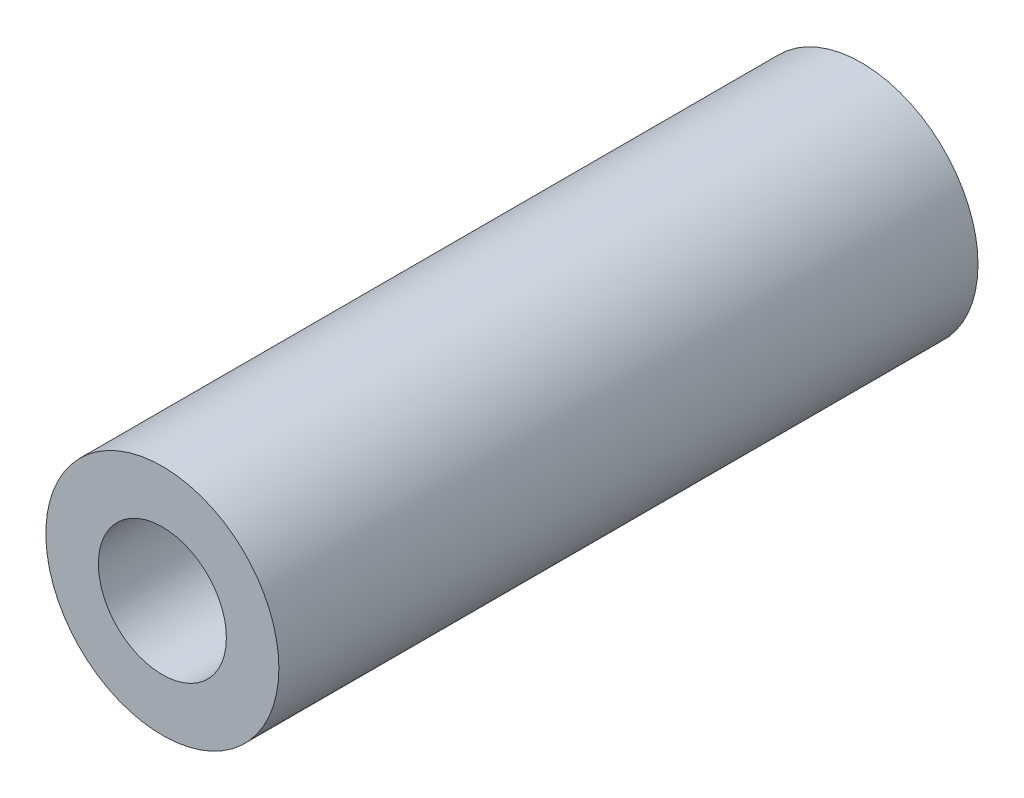
ISO-10303-21;
HEADER;
FILE_DESCRIPTION(('STEP AP214'),'2;1');
FILE_NAME('part.step','',(''),(''),'','','');
FILE_SCHEMA(('AUTOMOTIVE_DESIGN { 1 0 10303 214 1 1 1 1 }'));
ENDSEC;
DATA;
#1=APPLICATION_CONTEXT('core data for automotive mechanical design processes');
#2=APPLICATION_PROTOCOL_DEFINITION('international standard','automotive_design',2000,#1);
#3=PRODUCT_CONTEXT('',#1,'mechanical');
#4=PRODUCT('Part','Part','',(#3));
#5=PRODUCT_RELATED_PRODUCT_CATEGORY('part','',(#4));
#6=PRODUCT_DEFINITION_FORMATION('','',#4);
#7=PRODUCT_DEFINITION_CONTEXT('part definition',#1,'design');
#8=PRODUCT_DEFINITION('design','',#6,#7);
#9=PRODUCT_DEFINITION_SHAPE('','',#8);
#10=(LENGTH_UNIT() NAMED_UNIT(*) SI_UNIT(.MILLI.,.METRE.));
#11=(NAMED_UNIT(*) PLANE_ANGLE_UNIT() SI_UNIT($,.RADIAN.));
#12=(NAMED_UNIT(*) SI_UNIT($,.STERADIAN.) SOLID_ANGLE_UNIT());
#13=UNCERTAINTY_MEASURE_WITH_UNIT(LENGTH_MEASURE(1.E-05),#10,'distance_accuracy_value','');
#14=(GEOMETRIC_REPRESENTATION_CONTEXT(3) GLOBAL_UNCERTAINTY_ASSIGNED_CONTEXT((#13)) GLOBAL_UNIT_ASSIGNED_CONTEXT((#10,
#11,#12)) REPRESENTATION_CONTEXT('',''));
#15=CARTESIAN_POINT('',(0.,0.,0.));
#16=DIRECTION('',(0.,0.,1.));
#17=DIRECTION('',(1.,0.,0.));
#18=AXIS2_PLACEMENT_3D('',#15,#16,#17);
#19=CARTESIAN_POINT('',(0.,0.,28.575));
#20=DIRECTION('',(0.,0.,-1.));
#21=DIRECTION('',(-1.,0.,0.));
#22=AXIS2_PLACEMENT_3D('',#19,#20,#21);
#23=CYLINDRICAL_SURFACE('',#22,4.7625);
#24=CARTESIAN_POINT('',(0.,0.,28.575));
#25=DIRECTION('',(0.,0.,1.));
#26=DIRECTION('',(1.,0.,0.));
#27=AXIS2_PLACEMENT_3D('',#24,#25,#26);
#28=CIRCLE('',#27,4.7625);
#29=CARTESIAN_POINT('',(4.7625,0.,28.575));
#30=VERTEX_POINT('',#29);
#31=EDGE_CURVE('E10',#30,#30,#28,.T.);
#32=ORIENTED_EDGE('',*,*,#31,.F.);
#33=EDGE_LOOP('',(#32));
#34=FACE_BOUND('',#33,.T.);
#35=CARTESIAN_POINT('',(0.,0.,0.));
#36=DIRECTION('',(0.,0.,1.));
#37=DIRECTION('',(1.,0.,0.));
#38=AXIS2_PLACEMENT_3D('',#35,#36,#37);
#39=CIRCLE('',#38,4.7625);
#40=CARTESIAN_POINT('',(4.7625,0.,0.));
#41=VERTEX_POINT('',#40);
#42=EDGE_CURVE('E18',#41,#41,#39,.T.);
#43=ORIENTED_EDGE('',*,*,#42,.T.);
#44=EDGE_LOOP('',(#43));
#45=FACE_BOUND('',#44,.T.);
#46=ADVANCED_FACE('F15',(#34,#45),#23,.T.);
#47=CARTESIAN_POINT('',(0.,0.,28.575));
#48=DIRECTION('',(0.,0.,1.));
#49=DIRECTION('',(1.,0.,0.));
#50=AXIS2_PLACEMENT_3D('',#47,#48,#49);
#51=PLANE('',#50);
#52=CARTESIAN_POINT('',(0.,0.,28.575));
#53=DIRECTION('',(0.,0.,1.));
#54=DIRECTION('',(1.,0.,0.));
#55=AXIS2_PLACEMENT_3D('',#52,#53,#54);
#56=CIRCLE('',#55,2.6162);
#57=CARTESIAN_POINT('',(2.6162,0.,28.575));
#58=VERTEX_POINT('',#57);
#59=EDGE_CURVE('E33',#58,#58,#56,.T.);
#60=ORIENTED_EDGE('',*,*,#59,.F.);
#61=EDGE_LOOP('',(#60));
#62=FACE_BOUND('',#61,.T.);
#63=ORIENTED_EDGE('',*,*,#31,.T.);
#64=EDGE_LOOP('',(#63));
#65=FACE_BOUND('',#64,.T.);
#66=ADVANCED_FACE('F40',(#62,#65),#51,.T.);
#67=CARTESIAN_POINT('',(0.,0.,0.));
#68=DIRECTION('',(0.,0.,1.));
#69=DIRECTION('',(1.,0.,0.));
#70=AXIS2_PLACEMENT_3D('',#67,#68,#69);
#71=PLANE('',#70);
#72=CARTESIAN_POINT('',(0.,0.,0.));
#73=DIRECTION('',(0.,0.,1.));
#74=DIRECTION('',(1.,0.,0.));
#75=AXIS2_PLACEMENT_3D('',#72,#73,#74);
#76=CIRCLE('',#75,2.6162);
#77=CARTESIAN_POINT('',(2.6162,0.,0.));
#78=VERTEX_POINT('',#77);
#79=EDGE_CURVE('E28',#78,#78,#76,.F.);
#80=ORIENTED_EDGE('',*,*,#79,.F.);
#81=EDGE_LOOP('',(#80));
#82=FACE_BOUND('',#81,.T.);
#83=ORIENTED_EDGE('',*,*,#42,.F.);
#84=EDGE_LOOP('',(#83));
#85=FACE_BOUND('',#84,.T.);
#86=ADVANCED_FACE('F42',(#82,#85),#71,.F.);
#87=CARTESIAN_POINT('',(0.,0.,-0.00199999999999853));
#88=DIRECTION('',(0.,0.,1.));
#89=DIRECTION('',(1.,0.,0.));
#90=AXIS2_PLACEMENT_3D('',#87,#88,#89);
#91=CYLINDRICAL_SURFACE('',#90,2.6162);
#92=ORIENTED_EDGE('',*,*,#79,.T.);
#93=EDGE_LOOP('',(#92));
#94=FACE_BOUND('',#93,.T.);
#95=ORIENTED_EDGE('',*,*,#59,.T.);
#96=EDGE_LOOP('',(#95));
#97=FACE_BOUND('',#96,.T.);
#98=ADVANCED_FACE('F38',(#94,#97),#91,.F.);
#99=CLOSED_SHELL('',(#46,#66,#86,#98));
#100=MANIFOLD_SOLID_BREP('B1',#99);
#101=ADVANCED_BREP_SHAPE_REPRESENTATION('',(#18,#100),#14);
#102=SHAPE_DEFINITION_REPRESENTATION(#9,#101);
ENDSEC;
END-ISO-10303-21;
